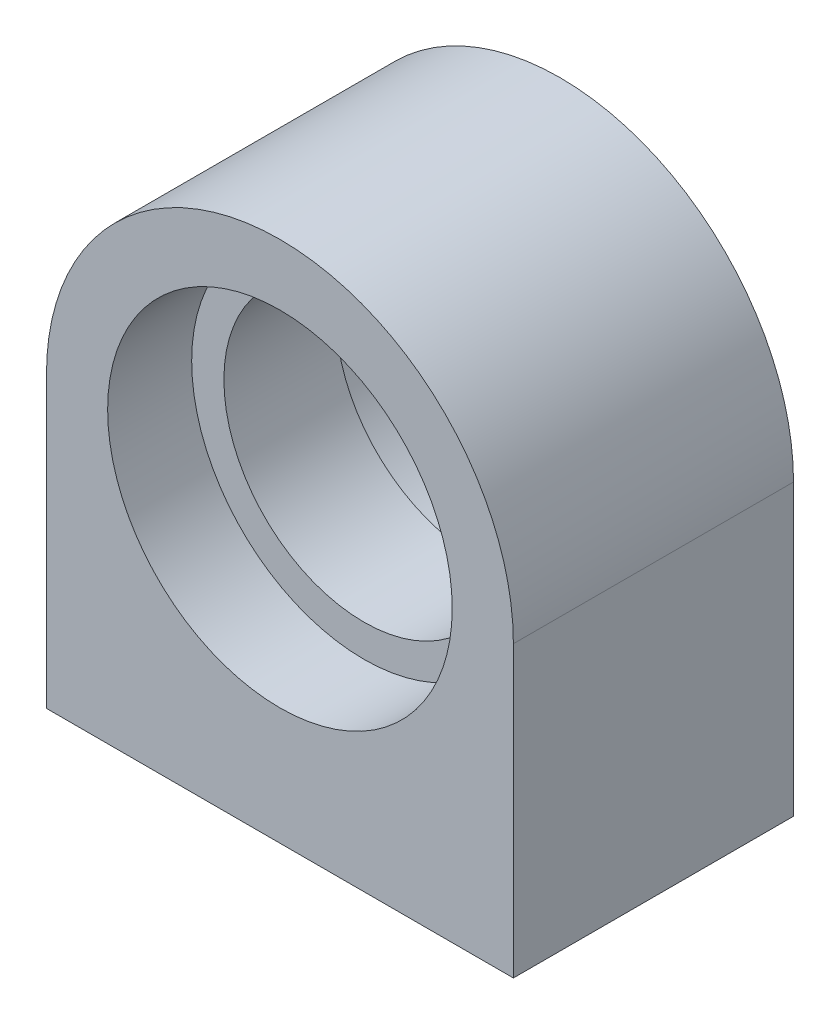
ISO-10303-21;
HEADER;
FILE_DESCRIPTION(('STEP AP214'),'2;1');
FILE_NAME('part.step','',(''),(''),'','','');
FILE_SCHEMA(('AUTOMOTIVE_DESIGN { 1 0 10303 214 1 1 1 1 }'));
ENDSEC;
DATA;
#1=APPLICATION_CONTEXT('core data for automotive mechanical design processes');
#2=APPLICATION_PROTOCOL_DEFINITION('international standard','automotive_design',2000,#1);
#3=PRODUCT_CONTEXT('',#1,'mechanical');
#4=PRODUCT('Part','Part','',(#3));
#5=PRODUCT_RELATED_PRODUCT_CATEGORY('part','',(#4));
#6=PRODUCT_DEFINITION_FORMATION('','',#4);
#7=PRODUCT_DEFINITION_CONTEXT('part definition',#1,'design');
#8=PRODUCT_DEFINITION('design','',#6,#7);
#9=PRODUCT_DEFINITION_SHAPE('','',#8);
#10=(LENGTH_UNIT() NAMED_UNIT(*) SI_UNIT(.MILLI.,.METRE.));
#11=(NAMED_UNIT(*) PLANE_ANGLE_UNIT() SI_UNIT($,.RADIAN.));
#12=(NAMED_UNIT(*) SI_UNIT($,.STERADIAN.) SOLID_ANGLE_UNIT());
#13=UNCERTAINTY_MEASURE_WITH_UNIT(LENGTH_MEASURE(1.E-05),#10,'distance_accuracy_value','');
#14=(GEOMETRIC_REPRESENTATION_CONTEXT(3) GLOBAL_UNCERTAINTY_ASSIGNED_CONTEXT((#13)) GLOBAL_UNIT_ASSIGNED_CONTEXT((#10,
#11,#12)) REPRESENTATION_CONTEXT('',''));
#15=CARTESIAN_POINT('',(0.,0.,0.));
#16=DIRECTION('',(0.,0.,1.));
#17=DIRECTION('',(1.,0.,0.));
#18=AXIS2_PLACEMENT_3D('',#15,#16,#17);
#19=CARTESIAN_POINT('',(0.,15.5,15.));
#20=DIRECTION('',(0.,0.,-1.));
#21=DIRECTION('',(-1.,0.,0.));
#22=AXIS2_PLACEMENT_3D('',#19,#20,#21);
#23=CYLINDRICAL_SURFACE('',#22,15.);
#24=CARTESIAN_POINT('',(0.,15.5,6.));
#25=DIRECTION('',(0.,0.,1.));
#26=DIRECTION('',(1.,0.,0.));
#27=AXIS2_PLACEMENT_3D('',#24,#25,#26);
#28=CIRCLE('',#27,15.);
#29=CARTESIAN_POINT('',(15.,15.5,6.));
#30=VERTEX_POINT('',#29);
#31=EDGE_CURVE('E124',#30,#30,#28,.T.);
#32=ORIENTED_EDGE('',*,*,#31,.T.);
#33=EDGE_LOOP('',(#32));
#34=FACE_BOUND('',#33,.T.);
#35=CARTESIAN_POINT('',(0.,15.5,-6.));
#36=DIRECTION('',(0.,0.,-1.));
#37=DIRECTION('',(-1.,0.,0.));
#38=AXIS2_PLACEMENT_3D('',#35,#36,#37);
#39=CIRCLE('',#38,15.);
#40=CARTESIAN_POINT('',(-15.,15.5,-6.));
#41=VERTEX_POINT('',#40);
#42=EDGE_CURVE('E49',#41,#41,#39,.T.);
#43=ORIENTED_EDGE('',*,*,#42,.T.);
#44=EDGE_LOOP('',(#43));
#45=FACE_BOUND('',#44,.T.);
#46=ADVANCED_FACE('F45',(#34,#45),#23,.F.);
#47=CARTESIAN_POINT('',(0.,15.5,15.));
#48=DIRECTION('',(0.,0.,-1.));
#49=DIRECTION('',(-1.,0.,0.));
#50=AXIS2_PLACEMENT_3D('',#47,#48,#49);
#51=CYLINDRICAL_SURFACE('',#50,25.);
#52=CARTESIAN_POINT('',(0.,15.5,-15.));
#53=DIRECTION('',(0.,0.,1.));
#54=DIRECTION('',(1.,0.,0.));
#55=AXIS2_PLACEMENT_3D('',#52,#53,#54);
#56=CIRCLE('',#55,25.);
#57=CARTESIAN_POINT('',(25.,15.5,-15.));
#58=VERTEX_POINT('',#57);
#59=CARTESIAN_POINT('',(-25.,15.5,-15.));
#60=VERTEX_POINT('',#59);
#61=EDGE_CURVE('E120',#58,#60,#56,.T.);
#62=ORIENTED_EDGE('',*,*,#61,.T.);
#63=DIRECTION('',(0.,0.,-1.));
#64=VECTOR('',#63,1.);
#65=CARTESIAN_POINT('',(-25.,15.5,15.));
#66=LINE('',#65,#64);
#67=CARTESIAN_POINT('',(-25.,15.5,15.));
#68=VERTEX_POINT('',#67);
#69=EDGE_CURVE('E11',#68,#60,#66,.T.);
#70=ORIENTED_EDGE('',*,*,#69,.F.);
#71=CARTESIAN_POINT('',(0.,15.5,15.));
#72=DIRECTION('',(0.,0.,1.));
#73=DIRECTION('',(1.,0.,0.));
#74=AXIS2_PLACEMENT_3D('',#71,#72,#73);
#75=CIRCLE('',#74,25.);
#76=CARTESIAN_POINT('',(25.,15.5,15.));
#77=VERTEX_POINT('',#76);
#78=EDGE_CURVE('E91',#77,#68,#75,.T.);
#79=ORIENTED_EDGE('',*,*,#78,.F.);
#80=DIRECTION('',(0.,0.,-1.));
#81=VECTOR('',#80,1.);
#82=CARTESIAN_POINT('',(25.,15.5,15.));
#83=LINE('',#82,#81);
#84=EDGE_CURVE('E119',#77,#58,#83,.T.);
#85=ORIENTED_EDGE('',*,*,#84,.T.);
#86=EDGE_LOOP('',(#62,#70,#79,#85));
#87=FACE_BOUND('',#86,.T.);
#88=ADVANCED_FACE('F47',(#87),#51,.T.);
#89=CARTESIAN_POINT('',(-25.,0.,15.));
#90=DIRECTION('',(-1.,0.,0.));
#91=DIRECTION('',(0.,0.,1.));
#92=AXIS2_PLACEMENT_3D('',#89,#90,#91);
#93=PLANE('',#92);
#94=DIRECTION('',(0.,1.,0.));
#95=VECTOR('',#94,1.);
#96=CARTESIAN_POINT('',(-25.,0.,-15.));
#97=LINE('',#96,#95);
#98=CARTESIAN_POINT('',(-25.,-15.5,-15.));
#99=VERTEX_POINT('',#98);
#100=EDGE_CURVE('E101',#99,#60,#97,.T.);
#101=ORIENTED_EDGE('',*,*,#100,.F.);
#102=DIRECTION('',(0.,0.,-1.));
#103=VECTOR('',#102,1.);
#104=CARTESIAN_POINT('',(-25.,-15.5,15.));
#105=LINE('',#104,#103);
#106=CARTESIAN_POINT('',(-25.,-15.5,15.));
#107=VERTEX_POINT('',#106);
#108=EDGE_CURVE('E56',#107,#99,#105,.T.);
#109=ORIENTED_EDGE('',*,*,#108,.F.);
#110=DIRECTION('',(0.,1.,0.));
#111=VECTOR('',#110,1.);
#112=CARTESIAN_POINT('',(-25.,0.,15.));
#113=LINE('',#112,#111);
#114=EDGE_CURVE('E99',#107,#68,#113,.T.);
#115=ORIENTED_EDGE('',*,*,#114,.T.);
#116=ORIENTED_EDGE('',*,*,#69,.T.);
#117=EDGE_LOOP('',(#101,#109,#115,#116));
#118=FACE_BOUND('',#117,.T.);
#119=ADVANCED_FACE('F98',(#118),#93,.T.);
#120=CARTESIAN_POINT('',(0.,-15.5,15.));
#121=DIRECTION('',(0.,1.,0.));
#122=DIRECTION('',(0.,0.,1.));
#123=AXIS2_PLACEMENT_3D('',#120,#121,#122);
#124=PLANE('',#123);
#125=CARTESIAN_POINT('',(-17.,-15.5,0.));
#126=DIRECTION('',(0.,-1.,0.));
#127=DIRECTION('',(0.,0.,-1.));
#128=AXIS2_PLACEMENT_3D('',#125,#126,#127);
#129=CIRCLE('',#128,1.65);
#130=CARTESIAN_POINT('',(-17.,-15.5,-1.65));
#131=VERTEX_POINT('',#130);
#132=EDGE_CURVE('E181',#131,#131,#129,.T.);
#133=ORIENTED_EDGE('',*,*,#132,.F.);
#134=EDGE_LOOP('',(#133));
#135=FACE_BOUND('',#134,.T.);
#136=CARTESIAN_POINT('',(-7.,-15.5,0.));
#137=DIRECTION('',(0.,-1.,0.));
#138=DIRECTION('',(0.,0.,-1.));
#139=AXIS2_PLACEMENT_3D('',#136,#137,#138);
#140=CIRCLE('',#139,1.65);
#141=CARTESIAN_POINT('',(-7.,-15.5,-1.65));
#142=VERTEX_POINT('',#141);
#143=EDGE_CURVE('E177',#142,#142,#140,.T.);
#144=ORIENTED_EDGE('',*,*,#143,.F.);
#145=EDGE_LOOP('',(#144));
#146=FACE_BOUND('',#145,.T.);
#147=CARTESIAN_POINT('',(7.,-15.5,0.));
#148=DIRECTION('',(0.,-1.,0.));
#149=DIRECTION('',(0.,0.,1.));
#150=AXIS2_PLACEMENT_3D('',#147,#148,#149);
#151=CIRCLE('',#150,1.65);
#152=CARTESIAN_POINT('',(7.,-15.5,1.65));
#153=VERTEX_POINT('',#152);
#154=EDGE_CURVE('E169',#153,#153,#151,.T.);
#155=ORIENTED_EDGE('',*,*,#154,.F.);
#156=EDGE_LOOP('',(#155));
#157=FACE_BOUND('',#156,.T.);
#158=CARTESIAN_POINT('',(17.,-15.5,0.));
#159=DIRECTION('',(0.,-1.,0.));
#160=DIRECTION('',(0.,0.,1.));
#161=AXIS2_PLACEMENT_3D('',#158,#159,#160);
#162=CIRCLE('',#161,1.65);
#163=CARTESIAN_POINT('',(17.,-15.5,1.65));
#164=VERTEX_POINT('',#163);
#165=EDGE_CURVE('E161',#164,#164,#162,.T.);
#166=ORIENTED_EDGE('',*,*,#165,.F.);
#167=EDGE_LOOP('',(#166));
#168=FACE_BOUND('',#167,.T.);
#169=DIRECTION('',(1.,0.,0.));
#170=VECTOR('',#169,1.);
#171=CARTESIAN_POINT('',(0.,-15.5,-15.));
#172=LINE('',#171,#170);
#173=CARTESIAN_POINT('',(25.,-15.5,-15.));
#174=VERTEX_POINT('',#173);
#175=EDGE_CURVE('E80',#99,#174,#172,.T.);
#176=ORIENTED_EDGE('',*,*,#175,.T.);
#177=DIRECTION('',(0.,0.,-1.));
#178=VECTOR('',#177,1.);
#179=CARTESIAN_POINT('',(25.,-15.5,15.));
#180=LINE('',#179,#178);
#181=CARTESIAN_POINT('',(25.,-15.5,15.));
#182=VERTEX_POINT('',#181);
#183=EDGE_CURVE('E103',#182,#174,#180,.T.);
#184=ORIENTED_EDGE('',*,*,#183,.F.);
#185=DIRECTION('',(1.,0.,0.));
#186=VECTOR('',#185,1.);
#187=CARTESIAN_POINT('',(0.,-15.5,15.));
#188=LINE('',#187,#186);
#189=EDGE_CURVE('E105',#107,#182,#188,.T.);
#190=ORIENTED_EDGE('',*,*,#189,.F.);
#191=ORIENTED_EDGE('',*,*,#108,.T.);
#192=EDGE_LOOP('',(#176,#184,#190,#191));
#193=FACE_BOUND('',#192,.T.);
#194=ADVANCED_FACE('F106',(#135,#146,#157,#168,#193),#124,.F.);
#195=CARTESIAN_POINT('',(25.,0.,15.));
#196=DIRECTION('',(-1.,0.,0.));
#197=DIRECTION('',(0.,0.,1.));
#198=AXIS2_PLACEMENT_3D('',#195,#196,#197);
#199=PLANE('',#198);
#200=DIRECTION('',(0.,1.,0.));
#201=VECTOR('',#200,1.);
#202=CARTESIAN_POINT('',(25.,0.,-15.));
#203=LINE('',#202,#201);
#204=EDGE_CURVE('E86',#174,#58,#203,.T.);
#205=ORIENTED_EDGE('',*,*,#204,.T.);
#206=ORIENTED_EDGE('',*,*,#84,.F.);
#207=DIRECTION('',(0.,1.,0.));
#208=VECTOR('',#207,1.);
#209=CARTESIAN_POINT('',(25.,0.,15.));
#210=LINE('',#209,#208);
#211=EDGE_CURVE('E65',#182,#77,#210,.T.);
#212=ORIENTED_EDGE('',*,*,#211,.F.);
#213=ORIENTED_EDGE('',*,*,#183,.T.);
#214=EDGE_LOOP('',(#205,#206,#212,#213));
#215=FACE_BOUND('',#214,.T.);
#216=ADVANCED_FACE('F200',(#215),#199,.F.);
#217=CARTESIAN_POINT('',(0.,0.,15.));
#218=DIRECTION('',(0.,0.,1.));
#219=DIRECTION('',(1.,0.,0.));
#220=AXIS2_PLACEMENT_3D('',#217,#218,#219);
#221=PLANE('',#220);
#222=CARTESIAN_POINT('',(0.,15.5,15.));
#223=DIRECTION('',(0.,0.,1.));
#224=DIRECTION('',(1.,0.,0.));
#225=AXIS2_PLACEMENT_3D('',#222,#223,#224);
#226=CIRCLE('',#225,18.45);
#227=CARTESIAN_POINT('',(18.45,15.5,15.));
#228=VERTEX_POINT('',#227);
#229=EDGE_CURVE('E141',#228,#228,#226,.T.);
#230=ORIENTED_EDGE('',*,*,#229,.F.);
#231=EDGE_LOOP('',(#230));
#232=FACE_BOUND('',#231,.T.);
#233=ORIENTED_EDGE('',*,*,#78,.T.);
#234=ORIENTED_EDGE('',*,*,#114,.F.);
#235=ORIENTED_EDGE('',*,*,#189,.T.);
#236=ORIENTED_EDGE('',*,*,#211,.T.);
#237=EDGE_LOOP('',(#233,#234,#235,#236));
#238=FACE_BOUND('',#237,.T.);
#239=ADVANCED_FACE('F109',(#232,#238),#221,.T.);
#240=CARTESIAN_POINT('',(0.,0.,-15.));
#241=DIRECTION('',(0.,0.,1.));
#242=DIRECTION('',(1.,0.,0.));
#243=AXIS2_PLACEMENT_3D('',#240,#241,#242);
#244=PLANE('',#243);
#245=CARTESIAN_POINT('',(0.,15.5,-15.));
#246=DIRECTION('',(0.,0.,1.));
#247=DIRECTION('',(1.,0.,0.));
#248=AXIS2_PLACEMENT_3D('',#245,#246,#247);
#249=CIRCLE('',#248,18.45);
#250=CARTESIAN_POINT('',(18.45,15.5,-15.));
#251=VERTEX_POINT('',#250);
#252=EDGE_CURVE('E149',#251,#251,#249,.T.);
#253=ORIENTED_EDGE('',*,*,#252,.T.);
#254=EDGE_LOOP('',(#253));
#255=FACE_BOUND('',#254,.T.);
#256=ORIENTED_EDGE('',*,*,#61,.F.);
#257=ORIENTED_EDGE('',*,*,#204,.F.);
#258=ORIENTED_EDGE('',*,*,#175,.F.);
#259=ORIENTED_EDGE('',*,*,#100,.T.);
#260=EDGE_LOOP('',(#256,#257,#258,#259));
#261=FACE_BOUND('',#260,.T.);
#262=ADVANCED_FACE('F233',(#255,#261),#244,.F.);
#263=CARTESIAN_POINT('',(0.,15.5,6.));
#264=DIRECTION('',(0.,0.,1.));
#265=DIRECTION('',(1.,0.,0.));
#266=AXIS2_PLACEMENT_3D('',#263,#264,#265);
#267=CYLINDRICAL_SURFACE('',#266,18.45);
#268=CARTESIAN_POINT('',(0.,15.5,6.));
#269=DIRECTION('',(0.,0.,1.));
#270=DIRECTION('',(1.,0.,0.));
#271=AXIS2_PLACEMENT_3D('',#268,#269,#270);
#272=CIRCLE('',#271,18.45);
#273=CARTESIAN_POINT('',(18.45,15.5,6.));
#274=VERTEX_POINT('',#273);
#275=EDGE_CURVE('E136',#274,#274,#272,.T.);
#276=ORIENTED_EDGE('',*,*,#275,.F.);
#277=EDGE_LOOP('',(#276));
#278=FACE_BOUND('',#277,.T.);
#279=ORIENTED_EDGE('',*,*,#229,.T.);
#280=EDGE_LOOP('',(#279));
#281=FACE_BOUND('',#280,.T.);
#282=ADVANCED_FACE('F257',(#278,#281),#267,.F.);
#283=CARTESIAN_POINT('',(0.,15.5,6.));
#284=DIRECTION('',(0.,0.,1.));
#285=DIRECTION('',(1.,0.,0.));
#286=AXIS2_PLACEMENT_3D('',#283,#284,#285);
#287=PLANE('',#286);
#288=ORIENTED_EDGE('',*,*,#31,.F.);
#289=EDGE_LOOP('',(#288));
#290=FACE_BOUND('',#289,.T.);
#291=ORIENTED_EDGE('',*,*,#275,.T.);
#292=EDGE_LOOP('',(#291));
#293=FACE_BOUND('',#292,.T.);
#294=ADVANCED_FACE('F263',(#290,#293),#287,.T.);
#295=CARTESIAN_POINT('',(0.,15.5,-6.));
#296=DIRECTION('',(0.,0.,-1.));
#297=DIRECTION('',(-1.,0.,0.));
#298=AXIS2_PLACEMENT_3D('',#295,#296,#297);
#299=CYLINDRICAL_SURFACE('',#298,18.45);
#300=CARTESIAN_POINT('',(0.,15.5,-6.));
#301=DIRECTION('',(0.,0.,1.));
#302=DIRECTION('',(1.,0.,0.));
#303=AXIS2_PLACEMENT_3D('',#300,#301,#302);
#304=CIRCLE('',#303,18.45);
#305=CARTESIAN_POINT('',(18.45,15.5,-6.));
#306=VERTEX_POINT('',#305);
#307=EDGE_CURVE('E153',#306,#306,#304,.T.);
#308=ORIENTED_EDGE('',*,*,#307,.T.);
#309=EDGE_LOOP('',(#308));
#310=FACE_BOUND('',#309,.T.);
#311=ORIENTED_EDGE('',*,*,#252,.F.);
#312=EDGE_LOOP('',(#311));
#313=FACE_BOUND('',#312,.T.);
#314=ADVANCED_FACE('F220',(#310,#313),#299,.F.);
#315=CARTESIAN_POINT('',(0.,15.5,-6.));
#316=DIRECTION('',(0.,0.,-1.));
#317=DIRECTION('',(1.,0.,0.));
#318=AXIS2_PLACEMENT_3D('',#315,#316,#317);
#319=PLANE('',#318);
#320=ORIENTED_EDGE('',*,*,#42,.F.);
#321=EDGE_LOOP('',(#320));
#322=FACE_BOUND('',#321,.T.);
#323=ORIENTED_EDGE('',*,*,#307,.F.);
#324=EDGE_LOOP('',(#323));
#325=FACE_BOUND('',#324,.T.);
#326=ADVANCED_FACE('F211',(#322,#325),#319,.T.);
#327=CARTESIAN_POINT('',(17.,-4.5,0.));
#328=DIRECTION('',(0.,-1.,0.));
#329=DIRECTION('',(0.,0.,-1.));
#330=AXIS2_PLACEMENT_3D('',#327,#328,#329);
#331=CYLINDRICAL_SURFACE('',#330,1.65);
#332=CARTESIAN_POINT('',(17.,-4.5,0.));
#333=DIRECTION('',(0.,-1.,0.));
#334=DIRECTION('',(0.,0.,1.));
#335=AXIS2_PLACEMENT_3D('',#332,#333,#334);
#336=CIRCLE('',#335,1.65);
#337=CARTESIAN_POINT('',(17.,-4.5,1.65));
#338=VERTEX_POINT('',#337);
#339=EDGE_CURVE('E157',#338,#338,#336,.T.);
#340=ORIENTED_EDGE('',*,*,#339,.F.);
#341=EDGE_LOOP('',(#340));
#342=FACE_BOUND('',#341,.T.);
#343=ORIENTED_EDGE('',*,*,#165,.T.);
#344=EDGE_LOOP('',(#343));
#345=FACE_BOUND('',#344,.T.);
#346=ADVANCED_FACE('F208',(#342,#345),#331,.F.);
#347=CARTESIAN_POINT('',(17.,-4.5,0.));
#348=DIRECTION('',(0.,1.,0.));
#349=DIRECTION('',(0.,0.,1.));
#350=AXIS2_PLACEMENT_3D('',#347,#348,#349);
#351=PLANE('',#350);
#352=ORIENTED_EDGE('',*,*,#339,.T.);
#353=EDGE_LOOP('',(#352));
#354=FACE_BOUND('',#353,.T.);
#355=ADVANCED_FACE('F210',(#354),#351,.F.);
#356=CARTESIAN_POINT('',(7.,-4.5,0.));
#357=DIRECTION('',(0.,-1.,0.));
#358=DIRECTION('',(0.,0.,-1.));
#359=AXIS2_PLACEMENT_3D('',#356,#357,#358);
#360=CYLINDRICAL_SURFACE('',#359,1.65);
#361=CARTESIAN_POINT('',(7.,-4.5,0.));
#362=DIRECTION('',(0.,-1.,0.));
#363=DIRECTION('',(0.,0.,1.));
#364=AXIS2_PLACEMENT_3D('',#361,#362,#363);
#365=CIRCLE('',#364,1.65);
#366=CARTESIAN_POINT('',(7.,-4.5,1.65));
#367=VERTEX_POINT('',#366);
#368=EDGE_CURVE('E165',#367,#367,#365,.T.);
#369=ORIENTED_EDGE('',*,*,#368,.F.);
#370=EDGE_LOOP('',(#369));
#371=FACE_BOUND('',#370,.T.);
#372=ORIENTED_EDGE('',*,*,#154,.T.);
#373=EDGE_LOOP('',(#372));
#374=FACE_BOUND('',#373,.T.);
#375=ADVANCED_FACE('F217',(#371,#374),#360,.F.);
#376=CARTESIAN_POINT('',(7.,-4.5,0.));
#377=DIRECTION('',(0.,1.,0.));
#378=DIRECTION('',(0.,0.,1.));
#379=AXIS2_PLACEMENT_3D('',#376,#377,#378);
#380=PLANE('',#379);
#381=ORIENTED_EDGE('',*,*,#368,.T.);
#382=EDGE_LOOP('',(#381));
#383=FACE_BOUND('',#382,.T.);
#384=ADVANCED_FACE('F308',(#383),#380,.F.);
#385=CARTESIAN_POINT('',(-7.,-4.5,0.));
#386=DIRECTION('',(0.,-1.,0.));
#387=DIRECTION('',(0.,0.,-1.));
#388=AXIS2_PLACEMENT_3D('',#385,#386,#387);
#389=CYLINDRICAL_SURFACE('',#388,1.65);
#390=CARTESIAN_POINT('',(-7.,-4.5,0.));
#391=DIRECTION('',(0.,-1.,0.));
#392=DIRECTION('',(0.,0.,-1.));
#393=AXIS2_PLACEMENT_3D('',#390,#391,#392);
#394=CIRCLE('',#393,1.65);
#395=CARTESIAN_POINT('',(-7.,-4.5,-1.65));
#396=VERTEX_POINT('',#395);
#397=EDGE_CURVE('E173',#396,#396,#394,.T.);
#398=ORIENTED_EDGE('',*,*,#397,.F.);
#399=EDGE_LOOP('',(#398));
#400=FACE_BOUND('',#399,.T.);
#401=ORIENTED_EDGE('',*,*,#143,.T.);
#402=EDGE_LOOP('',(#401));
#403=FACE_BOUND('',#402,.T.);
#404=ADVANCED_FACE('F319',(#400,#403),#389,.F.);
#405=CARTESIAN_POINT('',(-7.,-4.5,0.));
#406=DIRECTION('',(0.,-1.,0.));
#407=DIRECTION('',(0.,0.,-1.));
#408=AXIS2_PLACEMENT_3D('',#405,#406,#407);
#409=PLANE('',#408);
#410=ORIENTED_EDGE('',*,*,#397,.T.);
#411=EDGE_LOOP('',(#410));
#412=FACE_BOUND('',#411,.T.);
#413=ADVANCED_FACE('F194',(#412),#409,.T.);
#414=CARTESIAN_POINT('',(-17.,-4.5,0.));
#415=DIRECTION('',(0.,-1.,0.));
#416=DIRECTION('',(0.,0.,-1.));
#417=AXIS2_PLACEMENT_3D('',#414,#415,#416);
#418=CYLINDRICAL_SURFACE('',#417,1.65);
#419=CARTESIAN_POINT('',(-17.,-4.5,0.));
#420=DIRECTION('',(0.,-1.,0.));
#421=DIRECTION('',(0.,0.,-1.));
#422=AXIS2_PLACEMENT_3D('',#419,#420,#421);
#423=CIRCLE('',#422,1.65);
#424=CARTESIAN_POINT('',(-17.,-4.5,-1.65));
#425=VERTEX_POINT('',#424);
#426=EDGE_CURVE('E154',#425,#425,#423,.T.);
#427=ORIENTED_EDGE('',*,*,#426,.F.);
#428=EDGE_LOOP('',(#427));
#429=FACE_BOUND('',#428,.T.);
#430=ORIENTED_EDGE('',*,*,#132,.T.);
#431=EDGE_LOOP('',(#430));
#432=FACE_BOUND('',#431,.T.);
#433=ADVANCED_FACE('F191',(#429,#432),#418,.F.);
#434=CARTESIAN_POINT('',(-17.,-4.5,0.));
#435=DIRECTION('',(0.,-1.,0.));
#436=DIRECTION('',(0.,0.,-1.));
#437=AXIS2_PLACEMENT_3D('',#434,#435,#436);
#438=PLANE('',#437);
#439=ORIENTED_EDGE('',*,*,#426,.T.);
#440=EDGE_LOOP('',(#439));
#441=FACE_BOUND('',#440,.T.);
#442=ADVANCED_FACE('F189',(#441),#438,.T.);
#443=CLOSED_SHELL('',(#46,#88,#119,#194,#216,#239,#262,#282,#294,#314,#326,#346,#355,#375,#384,
#404,#413,#433,#442));
#444=MANIFOLD_SOLID_BREP('B2',#443);
#445=ADVANCED_BREP_SHAPE_REPRESENTATION('',(#18,#444),#14);
#446=SHAPE_DEFINITION_REPRESENTATION(#9,#445);
ENDSEC;
END-ISO-10303-21;
